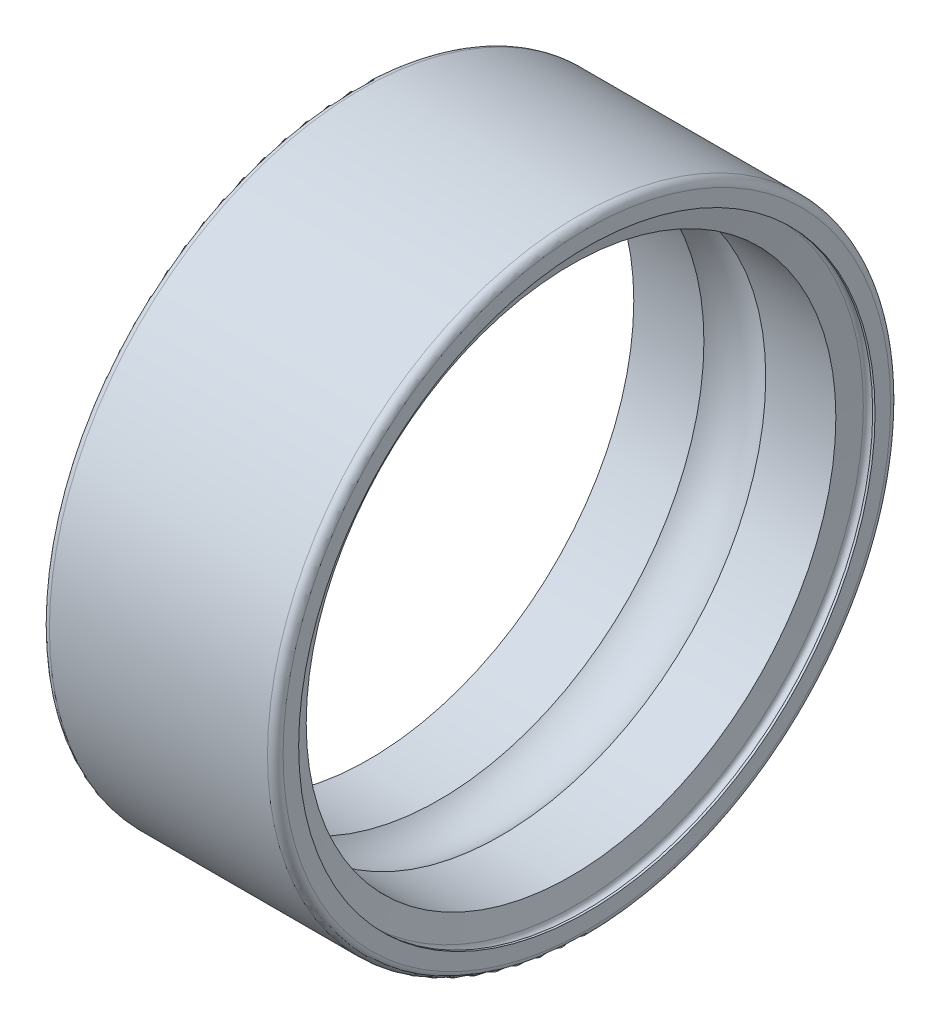
ISO-10303-21;
HEADER;
FILE_DESCRIPTION(('STEP AP214'),'2;1');
FILE_NAME('part.step','',(''),(''),'','','');
FILE_SCHEMA(('AUTOMOTIVE_DESIGN { 1 0 10303 214 1 1 1 1 }'));
ENDSEC;
DATA;
#1=APPLICATION_CONTEXT('core data for automotive mechanical design processes');
#2=APPLICATION_PROTOCOL_DEFINITION('international standard','automotive_design',2000,#1);
#3=PRODUCT_CONTEXT('',#1,'mechanical');
#4=PRODUCT('Part','Part','',(#3));
#5=PRODUCT_RELATED_PRODUCT_CATEGORY('part','',(#4));
#6=PRODUCT_DEFINITION_FORMATION('','',#4);
#7=PRODUCT_DEFINITION_CONTEXT('part definition',#1,'design');
#8=PRODUCT_DEFINITION('design','',#6,#7);
#9=PRODUCT_DEFINITION_SHAPE('','',#8);
#10=(LENGTH_UNIT() NAMED_UNIT(*) SI_UNIT(.MILLI.,.METRE.));
#11=(NAMED_UNIT(*) PLANE_ANGLE_UNIT() SI_UNIT($,.RADIAN.));
#12=(NAMED_UNIT(*) SI_UNIT($,.STERADIAN.) SOLID_ANGLE_UNIT());
#13=UNCERTAINTY_MEASURE_WITH_UNIT(LENGTH_MEASURE(1.E-05),#10,'distance_accuracy_value','');
#14=(GEOMETRIC_REPRESENTATION_CONTEXT(3) GLOBAL_UNCERTAINTY_ASSIGNED_CONTEXT((#13)) GLOBAL_UNIT_ASSIGNED_CONTEXT((#10,
#11,#12)) REPRESENTATION_CONTEXT('',''));
#15=CARTESIAN_POINT('',(0.,0.,0.));
#16=DIRECTION('',(0.,0.,1.));
#17=DIRECTION('',(1.,0.,0.));
#18=AXIS2_PLACEMENT_3D('',#15,#16,#17);
#19=CARTESIAN_POINT('',(0.0999999999999227,0.,0.));
#20=DIRECTION('',(-1.,0.,0.));
#21=DIRECTION('',(0.,0.,1.));
#22=AXIS2_PLACEMENT_3D('',#19,#20,#21);
#23=TOROIDAL_SURFACE('',#22,3.90000000000008,0.0999999999999227);
#24=CARTESIAN_POINT('',(0.,0.,0.));
#25=DIRECTION('',(-1.,0.,0.));
#26=DIRECTION('',(0.,0.,1.));
#27=AXIS2_PLACEMENT_3D('',#24,#25,#26);
#28=CIRCLE('',#27,3.9);
#29=CARTESIAN_POINT('',(0.,0.,3.9));
#30=VERTEX_POINT('',#29);
#31=EDGE_CURVE('E10',#30,#30,#28,.T.);
#32=ORIENTED_EDGE('',*,*,#31,.F.);
#33=EDGE_LOOP('',(#32));
#34=FACE_BOUND('',#33,.T.);
#35=CARTESIAN_POINT('',(0.100000000000003,0.,0.));
#36=DIRECTION('',(-1.,0.,0.));
#37=DIRECTION('',(0.,0.,1.));
#38=AXIS2_PLACEMENT_3D('',#35,#36,#37);
#39=CIRCLE('',#38,4.);
#40=CARTESIAN_POINT('',(0.100000000000003,0.,4.));
#41=VERTEX_POINT('',#40);
#42=EDGE_CURVE('E76',#41,#41,#39,.T.);
#43=ORIENTED_EDGE('',*,*,#42,.T.);
#44=EDGE_LOOP('',(#43));
#45=FACE_BOUND('',#44,.T.);
#46=ADVANCED_FACE('F30',(#34,#45),#23,.T.);
#47=CARTESIAN_POINT('',(0.,3.9,0.));
#48=DIRECTION('',(1.,0.,0.));
#49=DIRECTION('',(0.,0.,-1.));
#50=AXIS2_PLACEMENT_3D('',#47,#48,#49);
#51=PLANE('',#50);
#52=CARTESIAN_POINT('',(0.,0.,0.));
#53=DIRECTION('',(-1.,0.,0.));
#54=DIRECTION('',(0.,0.,1.));
#55=AXIS2_PLACEMENT_3D('',#52,#53,#54);
#56=CIRCLE('',#55,3.7);
#57=CARTESIAN_POINT('',(0.,0.,3.7));
#58=VERTEX_POINT('',#57);
#59=EDGE_CURVE('E36',#58,#58,#56,.T.);
#60=ORIENTED_EDGE('',*,*,#59,.F.);
#61=EDGE_LOOP('',(#60));
#62=FACE_BOUND('',#61,.T.);
#63=ORIENTED_EDGE('',*,*,#31,.T.);
#64=EDGE_LOOP('',(#63));
#65=FACE_BOUND('',#64,.T.);
#66=ADVANCED_FACE('F149',(#62,#65),#51,.F.);
#67=CARTESIAN_POINT('',(50.,0.,0.));
#68=DIRECTION('',(-1.,0.,0.));
#69=DIRECTION('',(0.,0.,1.));
#70=AXIS2_PLACEMENT_3D('',#67,#68,#69);
#71=CYLINDRICAL_SURFACE('',#70,3.7);
#72=CARTESIAN_POINT('',(0.0300000000000022,0.,0.));
#73=DIRECTION('',(-1.,0.,0.));
#74=DIRECTION('',(0.,0.,1.));
#75=AXIS2_PLACEMENT_3D('',#72,#73,#74);
#76=CIRCLE('',#75,3.7);
#77=CARTESIAN_POINT('',(0.0300000000000022,0.,3.7));
#78=VERTEX_POINT('',#77);
#79=EDGE_CURVE('E40',#78,#78,#76,.T.);
#80=ORIENTED_EDGE('',*,*,#79,.F.);
#81=EDGE_LOOP('',(#80));
#82=FACE_BOUND('',#81,.T.);
#83=ORIENTED_EDGE('',*,*,#59,.T.);
#84=EDGE_LOOP('',(#83));
#85=FACE_BOUND('',#84,.T.);
#86=ADVANCED_FACE('F144',(#82,#85),#71,.F.);
#87=CARTESIAN_POINT('',(0.09,0.,0.));
#88=DIRECTION('',(-1.,0.,0.));
#89=DIRECTION('',(0.,0.,1.));
#90=AXIS2_PLACEMENT_3D('',#87,#88,#89);
#91=TOROIDAL_SURFACE('',#90,3.7,0.06);
#92=CARTESIAN_POINT('',(0.149999999999997,0.,0.));
#93=DIRECTION('',(-1.,0.,0.));
#94=DIRECTION('',(0.,0.,1.));
#95=AXIS2_PLACEMENT_3D('',#92,#93,#94);
#96=CIRCLE('',#95,3.7);
#97=CARTESIAN_POINT('',(0.149999999999997,0.,3.7));
#98=VERTEX_POINT('',#97);
#99=EDGE_CURVE('E44',#98,#98,#96,.T.);
#100=ORIENTED_EDGE('',*,*,#99,.F.);
#101=EDGE_LOOP('',(#100));
#102=FACE_BOUND('',#101,.T.);
#103=ORIENTED_EDGE('',*,*,#79,.T.);
#104=EDGE_LOOP('',(#103));
#105=FACE_BOUND('',#104,.T.);
#106=ADVANCED_FACE('F138',(#102,#105),#91,.F.);
#107=CARTESIAN_POINT('',(0.149999999999997,0.,0.));
#108=DIRECTION('',(-1.,0.,0.));
#109=DIRECTION('',(0.,0.,1.));
#110=AXIS2_PLACEMENT_3D('',#107,#108,#109);
#111=CONICAL_SURFACE('',#110,3.7,1.39626340159545);
#112=CARTESIAN_POINT('',(0.202898094212541,0.,0.));
#113=DIRECTION('',(-1.,0.,0.));
#114=DIRECTION('',(0.,0.,1.));
#115=AXIS2_PLACEMENT_3D('',#112,#113,#114);
#116=CIRCLE('',#115,3.4);
#117=CARTESIAN_POINT('',(0.202898094212541,0.,3.4));
#118=VERTEX_POINT('',#117);
#119=EDGE_CURVE('E49',#118,#118,#116,.T.);
#120=ORIENTED_EDGE('',*,*,#119,.F.);
#121=EDGE_LOOP('',(#120));
#122=FACE_BOUND('',#121,.T.);
#123=ORIENTED_EDGE('',*,*,#99,.T.);
#124=EDGE_LOOP('',(#123));
#125=FACE_BOUND('',#124,.T.);
#126=ADVANCED_FACE('F132',(#122,#125),#111,.F.);
#127=CARTESIAN_POINT('',(50.,0.,0.));
#128=DIRECTION('',(-1.,0.,0.));
#129=DIRECTION('',(0.,0.,1.));
#130=AXIS2_PLACEMENT_3D('',#127,#128,#129);
#131=CYLINDRICAL_SURFACE('',#130,3.4);
#132=CARTESIAN_POINT('',(1.1031373033403,0.,0.));
#133=DIRECTION('',(-1.,0.,0.));
#134=DIRECTION('',(0.,0.,1.));
#135=AXIS2_PLACEMENT_3D('',#132,#133,#134);
#136=CIRCLE('',#135,3.4);
#137=CARTESIAN_POINT('',(1.1031373033403,0.,3.4));
#138=VERTEX_POINT('',#137);
#139=EDGE_CURVE('E52',#138,#138,#136,.T.);
#140=ORIENTED_EDGE('',*,*,#139,.F.);
#141=EDGE_LOOP('',(#140));
#142=FACE_BOUND('',#141,.T.);
#143=ORIENTED_EDGE('',*,*,#119,.T.);
#144=EDGE_LOOP('',(#143));
#145=FACE_BOUND('',#144,.T.);
#146=ADVANCED_FACE('F126',(#142,#145),#131,.F.);
#147=CARTESIAN_POINT('',(1.5,0.,0.));
#148=DIRECTION('',(-1.,0.,0.));
#149=DIRECTION('',(0.,0.,1.));
#150=AXIS2_PLACEMENT_3D('',#147,#148,#149);
#151=TOROIDAL_SURFACE('',#150,2.94999999999997,0.600000000000029);
#152=CARTESIAN_POINT('',(1.8968626966597,0.,0.));
#153=DIRECTION('',(-1.,0.,0.));
#154=DIRECTION('',(0.,0.,1.));
#155=AXIS2_PLACEMENT_3D('',#152,#153,#154);
#156=CIRCLE('',#155,3.4);
#157=CARTESIAN_POINT('',(1.8968626966597,0.,3.4));
#158=VERTEX_POINT('',#157);
#159=EDGE_CURVE('E55',#158,#158,#156,.T.);
#160=ORIENTED_EDGE('',*,*,#159,.F.);
#161=EDGE_LOOP('',(#160));
#162=FACE_BOUND('',#161,.T.);
#163=ORIENTED_EDGE('',*,*,#139,.T.);
#164=EDGE_LOOP('',(#163));
#165=FACE_BOUND('',#164,.T.);
#166=ADVANCED_FACE('F120',(#162,#165),#151,.F.);
#167=CARTESIAN_POINT('',(50.,0.,0.));
#168=DIRECTION('',(-1.,0.,0.));
#169=DIRECTION('',(0.,0.,1.));
#170=AXIS2_PLACEMENT_3D('',#167,#168,#169);
#171=CYLINDRICAL_SURFACE('',#170,3.4);
#172=CARTESIAN_POINT('',(2.7971019057875,0.,0.));
#173=DIRECTION('',(-1.,0.,0.));
#174=DIRECTION('',(0.,0.,1.));
#175=AXIS2_PLACEMENT_3D('',#172,#173,#174);
#176=CIRCLE('',#175,3.4);
#177=CARTESIAN_POINT('',(2.7971019057875,0.,3.4));
#178=VERTEX_POINT('',#177);
#179=EDGE_CURVE('E58',#178,#178,#176,.T.);
#180=ORIENTED_EDGE('',*,*,#179,.F.);
#181=EDGE_LOOP('',(#180));
#182=FACE_BOUND('',#181,.T.);
#183=ORIENTED_EDGE('',*,*,#159,.T.);
#184=EDGE_LOOP('',(#183));
#185=FACE_BOUND('',#184,.T.);
#186=ADVANCED_FACE('F114',(#182,#185),#171,.F.);
#187=CARTESIAN_POINT('',(2.7971019057875,0.,0.));
#188=DIRECTION('',(1.,0.,0.));
#189=DIRECTION('',(0.,0.,-1.));
#190=AXIS2_PLACEMENT_3D('',#187,#188,#189);
#191=CONICAL_SURFACE('',#190,3.4,1.39626340159559);
#192=CARTESIAN_POINT('',(2.85,0.,0.));
#193=DIRECTION('',(-1.,0.,0.));
#194=DIRECTION('',(0.,0.,1.));
#195=AXIS2_PLACEMENT_3D('',#192,#193,#194);
#196=CIRCLE('',#195,3.7);
#197=CARTESIAN_POINT('',(2.85,0.,3.7));
#198=VERTEX_POINT('',#197);
#199=EDGE_CURVE('E61',#198,#198,#196,.T.);
#200=ORIENTED_EDGE('',*,*,#199,.F.);
#201=EDGE_LOOP('',(#200));
#202=FACE_BOUND('',#201,.T.);
#203=ORIENTED_EDGE('',*,*,#179,.T.);
#204=EDGE_LOOP('',(#203));
#205=FACE_BOUND('',#204,.T.);
#206=ADVANCED_FACE('F108',(#202,#205),#191,.F.);
#207=CARTESIAN_POINT('',(2.91,0.,0.));
#208=DIRECTION('',(-1.,0.,0.));
#209=DIRECTION('',(0.,0.,1.));
#210=AXIS2_PLACEMENT_3D('',#207,#208,#209);
#211=TOROIDAL_SURFACE('',#210,3.7,0.0599999999999999);
#212=CARTESIAN_POINT('',(2.97,0.,0.));
#213=DIRECTION('',(-1.,0.,0.));
#214=DIRECTION('',(0.,0.,1.));
#215=AXIS2_PLACEMENT_3D('',#212,#213,#214);
#216=CIRCLE('',#215,3.7);
#217=CARTESIAN_POINT('',(2.97,0.,3.7));
#218=VERTEX_POINT('',#217);
#219=EDGE_CURVE('E64',#218,#218,#216,.T.);
#220=ORIENTED_EDGE('',*,*,#219,.F.);
#221=EDGE_LOOP('',(#220));
#222=FACE_BOUND('',#221,.T.);
#223=ORIENTED_EDGE('',*,*,#199,.T.);
#224=EDGE_LOOP('',(#223));
#225=FACE_BOUND('',#224,.T.);
#226=ADVANCED_FACE('F102',(#222,#225),#211,.F.);
#227=CARTESIAN_POINT('',(50.,0.,0.));
#228=DIRECTION('',(-1.,0.,0.));
#229=DIRECTION('',(0.,0.,1.));
#230=AXIS2_PLACEMENT_3D('',#227,#228,#229);
#231=CYLINDRICAL_SURFACE('',#230,3.7);
#232=CARTESIAN_POINT('',(3.,0.,0.));
#233=DIRECTION('',(-1.,0.,0.));
#234=DIRECTION('',(0.,0.,1.));
#235=AXIS2_PLACEMENT_3D('',#232,#233,#234);
#236=CIRCLE('',#235,3.7);
#237=CARTESIAN_POINT('',(3.,0.,3.7));
#238=VERTEX_POINT('',#237);
#239=EDGE_CURVE('E67',#238,#238,#236,.T.);
#240=ORIENTED_EDGE('',*,*,#239,.F.);
#241=EDGE_LOOP('',(#240));
#242=FACE_BOUND('',#241,.T.);
#243=ORIENTED_EDGE('',*,*,#219,.T.);
#244=EDGE_LOOP('',(#243));
#245=FACE_BOUND('',#244,.T.);
#246=ADVANCED_FACE('F96',(#242,#245),#231,.F.);
#247=CARTESIAN_POINT('',(3.,3.7,0.));
#248=DIRECTION('',(-1.,0.,0.));
#249=DIRECTION('',(0.,0.,1.));
#250=AXIS2_PLACEMENT_3D('',#247,#248,#249);
#251=PLANE('',#250);
#252=CARTESIAN_POINT('',(3.,0.,0.));
#253=DIRECTION('',(-1.,0.,0.));
#254=DIRECTION('',(0.,0.,1.));
#255=AXIS2_PLACEMENT_3D('',#252,#253,#254);
#256=CIRCLE('',#255,3.9);
#257=CARTESIAN_POINT('',(3.,0.,3.9));
#258=VERTEX_POINT('',#257);
#259=EDGE_CURVE('E70',#258,#258,#256,.T.);
#260=ORIENTED_EDGE('',*,*,#259,.F.);
#261=EDGE_LOOP('',(#260));
#262=FACE_BOUND('',#261,.T.);
#263=ORIENTED_EDGE('',*,*,#239,.T.);
#264=EDGE_LOOP('',(#263));
#265=FACE_BOUND('',#264,.T.);
#266=ADVANCED_FACE('F90',(#262,#265),#251,.F.);
#267=CARTESIAN_POINT('',(2.90000000000015,0.,0.));
#268=DIRECTION('',(-1.,0.,0.));
#269=DIRECTION('',(0.,0.,1.));
#270=AXIS2_PLACEMENT_3D('',#267,#268,#269);
#271=TOROIDAL_SURFACE('',#270,3.90000000000015,0.0999999999998459);
#272=CARTESIAN_POINT('',(2.9,0.,0.));
#273=DIRECTION('',(-1.,0.,0.));
#274=DIRECTION('',(0.,0.,1.));
#275=AXIS2_PLACEMENT_3D('',#272,#273,#274);
#276=CIRCLE('',#275,4.);
#277=CARTESIAN_POINT('',(2.9,0.,4.));
#278=VERTEX_POINT('',#277);
#279=EDGE_CURVE('E73',#278,#278,#276,.T.);
#280=ORIENTED_EDGE('',*,*,#279,.F.);
#281=EDGE_LOOP('',(#280));
#282=FACE_BOUND('',#281,.T.);
#283=ORIENTED_EDGE('',*,*,#259,.T.);
#284=EDGE_LOOP('',(#283));
#285=FACE_BOUND('',#284,.T.);
#286=ADVANCED_FACE('F84',(#282,#285),#271,.T.);
#287=CARTESIAN_POINT('',(50.,0.,0.));
#288=DIRECTION('',(-1.,0.,0.));
#289=DIRECTION('',(0.,0.,1.));
#290=AXIS2_PLACEMENT_3D('',#287,#288,#289);
#291=CYLINDRICAL_SURFACE('',#290,4.);
#292=ORIENTED_EDGE('',*,*,#42,.F.);
#293=EDGE_LOOP('',(#292));
#294=FACE_BOUND('',#293,.T.);
#295=ORIENTED_EDGE('',*,*,#279,.T.);
#296=EDGE_LOOP('',(#295));
#297=FACE_BOUND('',#296,.T.);
#298=ADVANCED_FACE('F81',(#294,#297),#291,.T.);
#299=CLOSED_SHELL('',(#46,#66,#86,#106,#126,#146,#166,#186,#206,#226,#246,#266,#286,#298));
#300=MANIFOLD_SOLID_BREP('B2',#299);
#301=ADVANCED_BREP_SHAPE_REPRESENTATION('',(#18,#300),#14);
#302=SHAPE_DEFINITION_REPRESENTATION(#9,#301);
ENDSEC;
END-ISO-10303-21;
